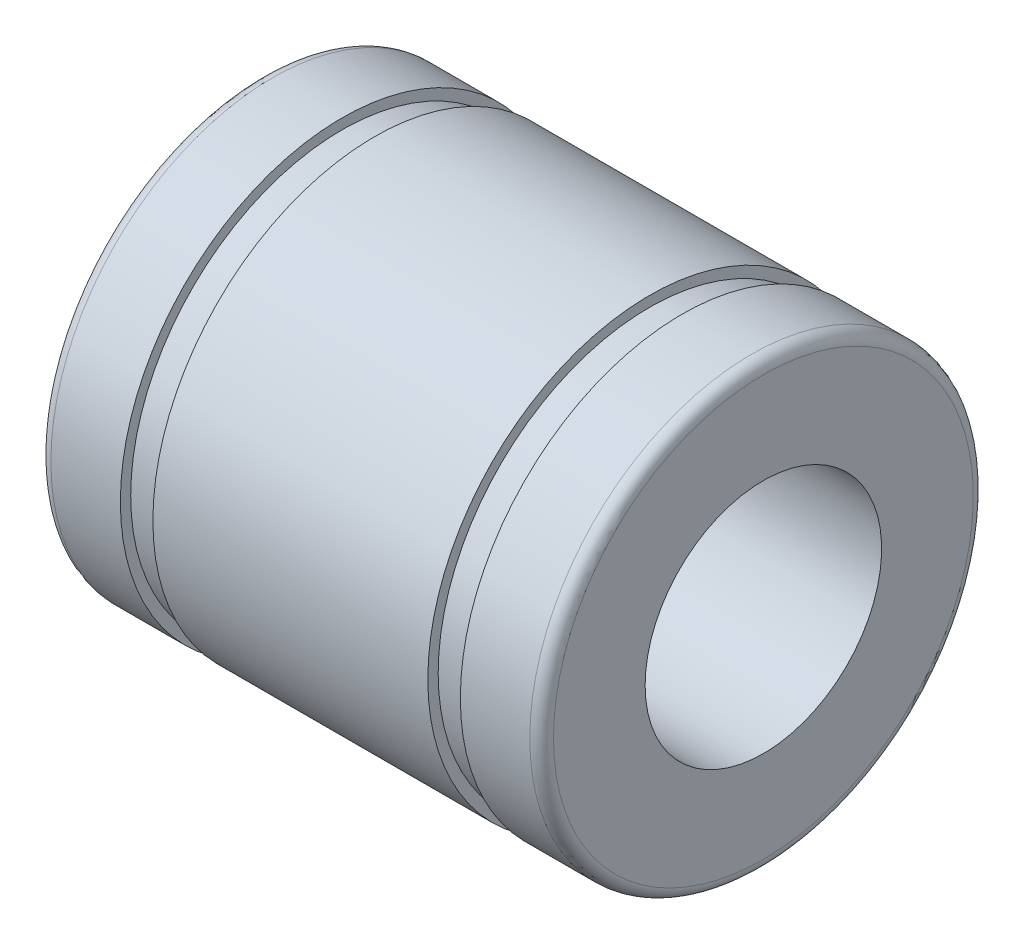
ISO-10303-21;
HEADER;
FILE_DESCRIPTION(('STEP AP214'),'2;1');
FILE_NAME('part.step','',(''),(''),'','','');
FILE_SCHEMA(('AUTOMOTIVE_DESIGN { 1 0 10303 214 1 1 1 1 }'));
ENDSEC;
DATA;
#1=APPLICATION_CONTEXT('core data for automotive mechanical design processes');
#2=APPLICATION_PROTOCOL_DEFINITION('international standard','automotive_design',2000,#1);
#3=PRODUCT_CONTEXT('',#1,'mechanical');
#4=PRODUCT('Part','Part','',(#3));
#5=PRODUCT_RELATED_PRODUCT_CATEGORY('part','',(#4));
#6=PRODUCT_DEFINITION_FORMATION('','',#4);
#7=PRODUCT_DEFINITION_CONTEXT('part definition',#1,'design');
#8=PRODUCT_DEFINITION('design','',#6,#7);
#9=PRODUCT_DEFINITION_SHAPE('','',#8);
#10=(LENGTH_UNIT() NAMED_UNIT(*) SI_UNIT(.MILLI.,.METRE.));
#11=(NAMED_UNIT(*) PLANE_ANGLE_UNIT() SI_UNIT($,.RADIAN.));
#12=(NAMED_UNIT(*) SI_UNIT($,.STERADIAN.) SOLID_ANGLE_UNIT());
#13=UNCERTAINTY_MEASURE_WITH_UNIT(LENGTH_MEASURE(1.E-05),#10,'distance_accuracy_value','');
#14=(GEOMETRIC_REPRESENTATION_CONTEXT(3) GLOBAL_UNCERTAINTY_ASSIGNED_CONTEXT((#13)) GLOBAL_UNIT_ASSIGNED_CONTEXT((#10,
#11,#12)) REPRESENTATION_CONTEXT('',''));
#15=CARTESIAN_POINT('',(0.,0.,0.));
#16=DIRECTION('',(0.,0.,1.));
#17=DIRECTION('',(1.,0.,0.));
#18=AXIS2_PLACEMENT_3D('',#15,#16,#17);
#19=CARTESIAN_POINT('',(0.,0.,0.));
#20=DIRECTION('',(-1.,0.,0.));
#21=DIRECTION('',(0.,0.,1.));
#22=AXIS2_PLACEMENT_3D('',#19,#20,#21);
#23=CYLINDRICAL_SURFACE('',#22,7.5);
#24=CARTESIAN_POINT('',(-4.65,0.,0.));
#25=DIRECTION('',(-1.,0.,0.));
#26=DIRECTION('',(0.,0.,1.));
#27=AXIS2_PLACEMENT_3D('',#24,#25,#26);
#28=CIRCLE('',#27,7.5);
#29=CARTESIAN_POINT('',(-4.65,0.,7.5));
#30=VERTEX_POINT('',#29);
#31=EDGE_CURVE('E79',#30,#30,#28,.T.);
#32=ORIENTED_EDGE('',*,*,#31,.F.);
#33=EDGE_LOOP('',(#32));
#34=FACE_BOUND('',#33,.T.);
#35=CARTESIAN_POINT('',(4.65,0.,0.));
#36=DIRECTION('',(-1.,0.,0.));
#37=DIRECTION('',(0.,0.,1.));
#38=AXIS2_PLACEMENT_3D('',#35,#36,#37);
#39=CIRCLE('',#38,7.5);
#40=CARTESIAN_POINT('',(4.65,0.,7.5));
#41=VERTEX_POINT('',#40);
#42=EDGE_CURVE('E87',#41,#41,#39,.T.);
#43=ORIENTED_EDGE('',*,*,#42,.T.);
#44=EDGE_LOOP('',(#43));
#45=FACE_BOUND('',#44,.T.);
#46=ADVANCED_FACE('F39',(#34,#45),#23,.T.);
#47=CARTESIAN_POINT('',(8.1,0.,0.));
#48=DIRECTION('',(-1.,0.,0.));
#49=DIRECTION('',(0.,0.,1.));
#50=AXIS2_PLACEMENT_3D('',#47,#48,#49);
#51=CIRCLE('',#50,7.5);
#52=CARTESIAN_POINT('',(8.1,0.,7.5));
#53=VERTEX_POINT('',#52);
#54=EDGE_CURVE('E58',#53,#53,#51,.T.);
#55=ORIENTED_EDGE('',*,*,#54,.T.);
#56=EDGE_LOOP('',(#55));
#57=FACE_BOUND('',#56,.T.);
#58=CARTESIAN_POINT('',(5.75,0.,0.));
#59=DIRECTION('',(-1.,0.,0.));
#60=DIRECTION('',(0.,0.,1.));
#61=AXIS2_PLACEMENT_3D('',#58,#59,#60);
#62=CIRCLE('',#61,7.5);
#63=CARTESIAN_POINT('',(5.75,0.,7.5));
#64=VERTEX_POINT('',#63);
#65=EDGE_CURVE('E99',#64,#64,#62,.T.);
#66=ORIENTED_EDGE('',*,*,#65,.F.);
#67=EDGE_LOOP('',(#66));
#68=FACE_BOUND('',#67,.T.);
#69=ADVANCED_FACE('F107',(#57,#68),#23,.T.);
#70=CARTESIAN_POINT('',(-8.1,0.,0.));
#71=DIRECTION('',(1.,0.,0.));
#72=DIRECTION('',(0.,0.,-1.));
#73=AXIS2_PLACEMENT_3D('',#70,#71,#72);
#74=CIRCLE('',#73,7.5);
#75=CARTESIAN_POINT('',(-8.1,0.,-7.5));
#76=VERTEX_POINT('',#75);
#77=EDGE_CURVE('E10',#76,#76,#74,.T.);
#78=ORIENTED_EDGE('',*,*,#77,.T.);
#79=EDGE_LOOP('',(#78));
#80=FACE_BOUND('',#79,.T.);
#81=CARTESIAN_POINT('',(-5.75,0.,0.));
#82=DIRECTION('',(-1.,0.,0.));
#83=DIRECTION('',(0.,0.,1.));
#84=AXIS2_PLACEMENT_3D('',#81,#82,#83);
#85=CIRCLE('',#84,7.5);
#86=CARTESIAN_POINT('',(-5.75,0.,7.5));
#87=VERTEX_POINT('',#86);
#88=EDGE_CURVE('E83',#87,#87,#85,.T.);
#89=ORIENTED_EDGE('',*,*,#88,.T.);
#90=EDGE_LOOP('',(#89));
#91=FACE_BOUND('',#90,.T.);
#92=ADVANCED_FACE('F109',(#80,#91),#23,.T.);
#93=CARTESIAN_POINT('',(-8.5,7.5,0.));
#94=DIRECTION('',(1.,0.,0.));
#95=DIRECTION('',(0.,0.,-1.));
#96=AXIS2_PLACEMENT_3D('',#93,#94,#95);
#97=PLANE('',#96);
#98=CARTESIAN_POINT('',(-8.5,0.,0.));
#99=DIRECTION('',(1.,0.,0.));
#100=DIRECTION('',(0.,0.,-1.));
#101=AXIS2_PLACEMENT_3D('',#98,#99,#100);
#102=CIRCLE('',#101,7.1);
#103=CARTESIAN_POINT('',(-8.5,0.,-7.1));
#104=VERTEX_POINT('',#103);
#105=EDGE_CURVE('E47',#104,#104,#102,.F.);
#106=ORIENTED_EDGE('',*,*,#105,.T.);
#107=EDGE_LOOP('',(#106));
#108=FACE_BOUND('',#107,.T.);
#109=CARTESIAN_POINT('',(-8.5,0.,0.));
#110=DIRECTION('',(-1.,0.,0.));
#111=DIRECTION('',(0.,0.,1.));
#112=AXIS2_PLACEMENT_3D('',#109,#110,#111);
#113=CIRCLE('',#112,4.);
#114=CARTESIAN_POINT('',(-8.5,0.,4.));
#115=VERTEX_POINT('',#114);
#116=EDGE_CURVE('E64',#115,#115,#113,.T.);
#117=ORIENTED_EDGE('',*,*,#116,.F.);
#118=EDGE_LOOP('',(#117));
#119=FACE_BOUND('',#118,.T.);
#120=ADVANCED_FACE('F115',(#108,#119),#97,.F.);
#121=CARTESIAN_POINT('',(0.,0.,0.));
#122=DIRECTION('',(-1.,0.,0.));
#123=DIRECTION('',(0.,0.,1.));
#124=AXIS2_PLACEMENT_3D('',#121,#122,#123);
#125=CYLINDRICAL_SURFACE('',#124,4.);
#126=CARTESIAN_POINT('',(8.5,0.,0.));
#127=DIRECTION('',(-1.,0.,0.));
#128=DIRECTION('',(0.,0.,1.));
#129=AXIS2_PLACEMENT_3D('',#126,#127,#128);
#130=CIRCLE('',#129,4.);
#131=CARTESIAN_POINT('',(8.5,0.,4.));
#132=VERTEX_POINT('',#131);
#133=EDGE_CURVE('E68',#132,#132,#130,.T.);
#134=ORIENTED_EDGE('',*,*,#133,.F.);
#135=EDGE_LOOP('',(#134));
#136=FACE_BOUND('',#135,.T.);
#137=ORIENTED_EDGE('',*,*,#116,.T.);
#138=EDGE_LOOP('',(#137));
#139=FACE_BOUND('',#138,.T.);
#140=ADVANCED_FACE('F124',(#136,#139),#125,.F.);
#141=CARTESIAN_POINT('',(8.5,7.5,0.));
#142=DIRECTION('',(-1.,0.,0.));
#143=DIRECTION('',(0.,0.,1.));
#144=AXIS2_PLACEMENT_3D('',#141,#142,#143);
#145=PLANE('',#144);
#146=CARTESIAN_POINT('',(8.5,0.,0.));
#147=DIRECTION('',(-1.,0.,0.));
#148=DIRECTION('',(0.,0.,1.));
#149=AXIS2_PLACEMENT_3D('',#146,#147,#148);
#150=CIRCLE('',#149,7.1);
#151=CARTESIAN_POINT('',(8.5,0.,7.1));
#152=VERTEX_POINT('',#151);
#153=EDGE_CURVE('E52',#152,#152,#150,.F.);
#154=ORIENTED_EDGE('',*,*,#153,.T.);
#155=EDGE_LOOP('',(#154));
#156=FACE_BOUND('',#155,.T.);
#157=ORIENTED_EDGE('',*,*,#133,.T.);
#158=EDGE_LOOP('',(#157));
#159=FACE_BOUND('',#158,.T.);
#160=ADVANCED_FACE('F121',(#156,#159),#145,.F.);
#161=CARTESIAN_POINT('',(-5.75,7.5,0.));
#162=DIRECTION('',(1.,0.,0.));
#163=DIRECTION('',(0.,0.,-1.));
#164=AXIS2_PLACEMENT_3D('',#161,#162,#163);
#165=PLANE('',#164);
#166=CARTESIAN_POINT('',(-5.75,0.,0.));
#167=DIRECTION('',(-1.,0.,0.));
#168=DIRECTION('',(0.,0.,1.));
#169=AXIS2_PLACEMENT_3D('',#166,#167,#168);
#170=CIRCLE('',#169,7.15);
#171=CARTESIAN_POINT('',(-5.75,0.,7.15));
#172=VERTEX_POINT('',#171);
#173=EDGE_CURVE('E72',#172,#172,#170,.T.);
#174=ORIENTED_EDGE('',*,*,#173,.T.);
#175=EDGE_LOOP('',(#174));
#176=FACE_BOUND('',#175,.T.);
#177=ORIENTED_EDGE('',*,*,#88,.F.);
#178=EDGE_LOOP('',(#177));
#179=FACE_BOUND('',#178,.T.);
#180=ADVANCED_FACE('F119',(#176,#179),#165,.T.);
#181=CARTESIAN_POINT('',(0.,0.,0.));
#182=DIRECTION('',(-1.,0.,0.));
#183=DIRECTION('',(0.,0.,1.));
#184=AXIS2_PLACEMENT_3D('',#181,#182,#183);
#185=CYLINDRICAL_SURFACE('',#184,7.15);
#186=CARTESIAN_POINT('',(-4.65,0.,0.));
#187=DIRECTION('',(-1.,0.,0.));
#188=DIRECTION('',(0.,0.,1.));
#189=AXIS2_PLACEMENT_3D('',#186,#187,#188);
#190=CIRCLE('',#189,7.15);
#191=CARTESIAN_POINT('',(-4.65,0.,7.15));
#192=VERTEX_POINT('',#191);
#193=EDGE_CURVE('E75',#192,#192,#190,.T.);
#194=ORIENTED_EDGE('',*,*,#193,.T.);
#195=EDGE_LOOP('',(#194));
#196=FACE_BOUND('',#195,.T.);
#197=ORIENTED_EDGE('',*,*,#173,.F.);
#198=EDGE_LOOP('',(#197));
#199=FACE_BOUND('',#198,.T.);
#200=ADVANCED_FACE('F158',(#196,#199),#185,.T.);
#201=CARTESIAN_POINT('',(-4.65,7.5,0.));
#202=DIRECTION('',(-1.,0.,0.));
#203=DIRECTION('',(0.,0.,1.));
#204=AXIS2_PLACEMENT_3D('',#201,#202,#203);
#205=PLANE('',#204);
#206=ORIENTED_EDGE('',*,*,#31,.T.);
#207=EDGE_LOOP('',(#206));
#208=FACE_BOUND('',#207,.T.);
#209=ORIENTED_EDGE('',*,*,#193,.F.);
#210=EDGE_LOOP('',(#209));
#211=FACE_BOUND('',#210,.T.);
#212=ADVANCED_FACE('F155',(#208,#211),#205,.T.);
#213=CARTESIAN_POINT('',(4.65,7.5,0.));
#214=DIRECTION('',(1.,0.,0.));
#215=DIRECTION('',(0.,0.,-1.));
#216=AXIS2_PLACEMENT_3D('',#213,#214,#215);
#217=PLANE('',#216);
#218=CARTESIAN_POINT('',(4.65,0.,0.));
#219=DIRECTION('',(-1.,0.,0.));
#220=DIRECTION('',(0.,0.,1.));
#221=AXIS2_PLACEMENT_3D('',#218,#219,#220);
#222=CIRCLE('',#221,7.15);
#223=CARTESIAN_POINT('',(4.65,0.,7.15));
#224=VERTEX_POINT('',#223);
#225=EDGE_CURVE('E91',#224,#224,#222,.T.);
#226=ORIENTED_EDGE('',*,*,#225,.T.);
#227=EDGE_LOOP('',(#226));
#228=FACE_BOUND('',#227,.T.);
#229=ORIENTED_EDGE('',*,*,#42,.F.);
#230=EDGE_LOOP('',(#229));
#231=FACE_BOUND('',#230,.T.);
#232=ADVANCED_FACE('F149',(#228,#231),#217,.T.);
#233=CARTESIAN_POINT('',(0.,0.,0.));
#234=DIRECTION('',(-1.,0.,0.));
#235=DIRECTION('',(0.,0.,1.));
#236=AXIS2_PLACEMENT_3D('',#233,#234,#235);
#237=CYLINDRICAL_SURFACE('',#236,7.15);
#238=CARTESIAN_POINT('',(5.75,0.,0.));
#239=DIRECTION('',(-1.,0.,0.));
#240=DIRECTION('',(0.,0.,1.));
#241=AXIS2_PLACEMENT_3D('',#238,#239,#240);
#242=CIRCLE('',#241,7.15);
#243=CARTESIAN_POINT('',(5.75,0.,7.15));
#244=VERTEX_POINT('',#243);
#245=EDGE_CURVE('E95',#244,#244,#242,.T.);
#246=ORIENTED_EDGE('',*,*,#245,.T.);
#247=EDGE_LOOP('',(#246));
#248=FACE_BOUND('',#247,.T.);
#249=ORIENTED_EDGE('',*,*,#225,.F.);
#250=EDGE_LOOP('',(#249));
#251=FACE_BOUND('',#250,.T.);
#252=ADVANCED_FACE('F137',(#248,#251),#237,.T.);
#253=CARTESIAN_POINT('',(5.75,7.5,0.));
#254=DIRECTION('',(-1.,0.,0.));
#255=DIRECTION('',(0.,0.,1.));
#256=AXIS2_PLACEMENT_3D('',#253,#254,#255);
#257=PLANE('',#256);
#258=ORIENTED_EDGE('',*,*,#65,.T.);
#259=EDGE_LOOP('',(#258));
#260=FACE_BOUND('',#259,.T.);
#261=ORIENTED_EDGE('',*,*,#245,.F.);
#262=EDGE_LOOP('',(#261));
#263=FACE_BOUND('',#262,.T.);
#264=ADVANCED_FACE('F104',(#260,#263),#257,.T.);
#265=CARTESIAN_POINT('',(8.1,0.,0.));
#266=DIRECTION('',(-1.,0.,0.));
#267=DIRECTION('',(0.,0.,1.));
#268=AXIS2_PLACEMENT_3D('',#265,#266,#267);
#269=TOROIDAL_SURFACE('',#268,7.1,0.4);
#270=ORIENTED_EDGE('',*,*,#153,.F.);
#271=EDGE_LOOP('',(#270));
#272=FACE_BOUND('',#271,.T.);
#273=ORIENTED_EDGE('',*,*,#54,.F.);
#274=EDGE_LOOP('',(#273));
#275=FACE_BOUND('',#274,.T.);
#276=ADVANCED_FACE('F130',(#272,#275),#269,.T.);
#277=CARTESIAN_POINT('',(-8.1,0.,0.));
#278=DIRECTION('',(1.,0.,0.));
#279=DIRECTION('',(0.,0.,-1.));
#280=AXIS2_PLACEMENT_3D('',#277,#278,#279);
#281=TOROIDAL_SURFACE('',#280,7.1,0.4);
#282=ORIENTED_EDGE('',*,*,#77,.F.);
#283=EDGE_LOOP('',(#282));
#284=FACE_BOUND('',#283,.T.);
#285=ORIENTED_EDGE('',*,*,#105,.F.);
#286=EDGE_LOOP('',(#285));
#287=FACE_BOUND('',#286,.T.);
#288=ADVANCED_FACE('F41',(#284,#287),#281,.T.);
#289=CLOSED_SHELL('',(#46,#69,#92,#120,#140,#160,#180,#200,#212,#232,#252,#264,#276,#288));
#290=MANIFOLD_SOLID_BREP('B2',#289);
#291=ADVANCED_BREP_SHAPE_REPRESENTATION('',(#18,#290),#14);
#292=SHAPE_DEFINITION_REPRESENTATION(#9,#291);
ENDSEC;
END-ISO-10303-21;
